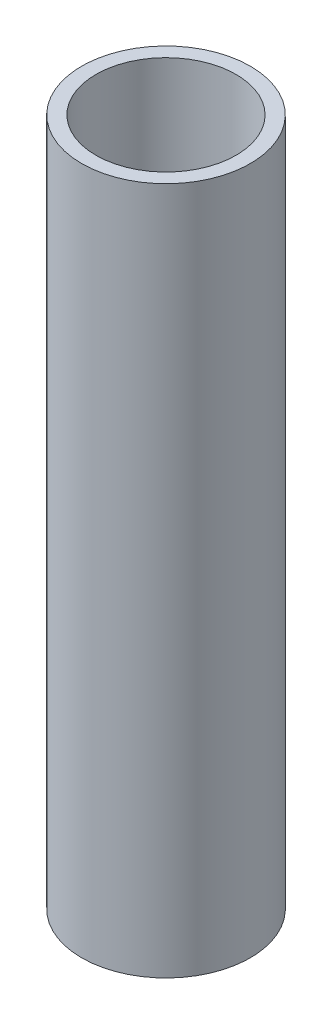
ISO-10303-21;
HEADER;
FILE_DESCRIPTION(('STEP AP214'),'2;1');
FILE_NAME('part.step','',(''),(''),'','','');
FILE_SCHEMA(('AUTOMOTIVE_DESIGN { 1 0 10303 214 1 1 1 1 }'));
ENDSEC;
DATA;
#1=APPLICATION_CONTEXT('core data for automotive mechanical design processes');
#2=APPLICATION_PROTOCOL_DEFINITION('international standard','automotive_design',2000,#1);
#3=PRODUCT_CONTEXT('',#1,'mechanical');
#4=PRODUCT('Part','Part','',(#3));
#5=PRODUCT_RELATED_PRODUCT_CATEGORY('part','',(#4));
#6=PRODUCT_DEFINITION_FORMATION('','',#4);
#7=PRODUCT_DEFINITION_CONTEXT('part definition',#1,'design');
#8=PRODUCT_DEFINITION('design','',#6,#7);
#9=PRODUCT_DEFINITION_SHAPE('','',#8);
#10=(LENGTH_UNIT() NAMED_UNIT(*) SI_UNIT(.MILLI.,.METRE.));
#11=(NAMED_UNIT(*) PLANE_ANGLE_UNIT() SI_UNIT($,.RADIAN.));
#12=(NAMED_UNIT(*) SI_UNIT($,.STERADIAN.) SOLID_ANGLE_UNIT());
#13=UNCERTAINTY_MEASURE_WITH_UNIT(LENGTH_MEASURE(1.E-05),#10,'distance_accuracy_value','');
#14=(GEOMETRIC_REPRESENTATION_CONTEXT(3) GLOBAL_UNCERTAINTY_ASSIGNED_CONTEXT((#13)) GLOBAL_UNIT_ASSIGNED_CONTEXT((#10,
#11,#12)) REPRESENTATION_CONTEXT('',''));
#15=CARTESIAN_POINT('',(0.,0.,0.));
#16=DIRECTION('',(0.,0.,1.));
#17=DIRECTION('',(1.,0.,0.));
#18=AXIS2_PLACEMENT_3D('',#15,#16,#17);
#19=CARTESIAN_POINT('',(0.,336.55,0.));
#20=DIRECTION('',(0.,-1.,0.));
#21=DIRECTION('',(0.,0.,-1.));
#22=AXIS2_PLACEMENT_3D('',#19,#20,#21);
#23=CYLINDRICAL_SURFACE('',#22,37.465);
#24=CARTESIAN_POINT('',(0.,0.,0.));
#25=DIRECTION('',(0.,1.,0.));
#26=DIRECTION('',(0.,0.,1.));
#27=AXIS2_PLACEMENT_3D('',#24,#25,#26);
#28=CIRCLE('',#27,37.465);
#29=CARTESIAN_POINT('',(0.,0.,37.465));
#30=VERTEX_POINT('',#29);
#31=EDGE_CURVE('E51',#30,#30,#28,.T.);
#32=ORIENTED_EDGE('',*,*,#31,.F.);
#33=EDGE_LOOP('',(#32));
#34=FACE_BOUND('',#33,.T.);
#35=CARTESIAN_POINT('',(0.,243.078,0.));
#36=DIRECTION('',(0.,1.,0.));
#37=DIRECTION('',(0.,0.,1.));
#38=AXIS2_PLACEMENT_3D('',#35,#36,#37);
#39=CIRCLE('',#38,37.465);
#40=CARTESIAN_POINT('',(0.,243.078,37.465));
#41=VERTEX_POINT('',#40);
#42=EDGE_CURVE('E45',#41,#41,#39,.T.);
#43=ORIENTED_EDGE('',*,*,#42,.T.);
#44=EDGE_LOOP('',(#43));
#45=FACE_BOUND('',#44,.T.);
#46=ADVANCED_FACE('F39',(#34,#45),#23,.F.);
#47=CARTESIAN_POINT('',(0.,336.55,0.));
#48=DIRECTION('',(0.,-1.,0.));
#49=DIRECTION('',(0.,0.,-1.));
#50=AXIS2_PLACEMENT_3D('',#47,#48,#49);
#51=CYLINDRICAL_SURFACE('',#50,41.275);
#52=CARTESIAN_POINT('',(0.,336.55,0.));
#53=DIRECTION('',(0.,1.,0.));
#54=DIRECTION('',(0.,0.,1.));
#55=AXIS2_PLACEMENT_3D('',#52,#53,#54);
#56=CIRCLE('',#55,41.275);
#57=CARTESIAN_POINT('',(0.,336.55,41.275));
#58=VERTEX_POINT('',#57);
#59=EDGE_CURVE('E10',#58,#58,#56,.T.);
#60=ORIENTED_EDGE('',*,*,#59,.F.);
#61=EDGE_LOOP('',(#60));
#62=FACE_BOUND('',#61,.T.);
#63=CARTESIAN_POINT('',(0.,0.,0.));
#64=DIRECTION('',(0.,1.,0.));
#65=DIRECTION('',(0.,0.,1.));
#66=AXIS2_PLACEMENT_3D('',#63,#64,#65);
#67=CIRCLE('',#66,41.275);
#68=CARTESIAN_POINT('',(0.,0.,41.275));
#69=VERTEX_POINT('',#68);
#70=EDGE_CURVE('E46',#69,#69,#67,.T.);
#71=ORIENTED_EDGE('',*,*,#70,.T.);
#72=EDGE_LOOP('',(#71));
#73=FACE_BOUND('',#72,.T.);
#74=ADVANCED_FACE('F74',(#62,#73),#51,.T.);
#75=CARTESIAN_POINT('',(0.,336.55,0.));
#76=DIRECTION('',(0.,1.,0.));
#77=DIRECTION('',(0.,0.,1.));
#78=AXIS2_PLACEMENT_3D('',#75,#76,#77);
#79=PLANE('',#78);
#80=ORIENTED_EDGE('',*,*,#59,.T.);
#81=EDGE_LOOP('',(#80));
#82=FACE_BOUND('',#81,.T.);
#83=CARTESIAN_POINT('',(0.,336.55,0.));
#84=DIRECTION('',(0.,1.,0.));
#85=DIRECTION('',(0.,0.,1.));
#86=AXIS2_PLACEMENT_3D('',#83,#84,#85);
#87=CIRCLE('',#86,34.29);
#88=CARTESIAN_POINT('',(0.,336.55,34.29));
#89=VERTEX_POINT('',#88);
#90=EDGE_CURVE('E53',#89,#89,#87,.T.);
#91=ORIENTED_EDGE('',*,*,#90,.F.);
#92=EDGE_LOOP('',(#91));
#93=FACE_BOUND('',#92,.T.);
#94=ADVANCED_FACE('F72',(#82,#93),#79,.T.);
#95=CARTESIAN_POINT('',(0.,0.,0.));
#96=DIRECTION('',(0.,1.,0.));
#97=DIRECTION('',(0.,0.,1.));
#98=AXIS2_PLACEMENT_3D('',#95,#96,#97);
#99=PLANE('',#98);
#100=ORIENTED_EDGE('',*,*,#31,.T.);
#101=EDGE_LOOP('',(#100));
#102=FACE_BOUND('',#101,.T.);
#103=ORIENTED_EDGE('',*,*,#70,.F.);
#104=EDGE_LOOP('',(#103));
#105=FACE_BOUND('',#104,.T.);
#106=ADVANCED_FACE('F71',(#102,#105),#99,.F.);
#107=CARTESIAN_POINT('',(0.,243.078,0.));
#108=DIRECTION('',(0.,1.,0.));
#109=DIRECTION('',(0.,0.,1.));
#110=AXIS2_PLACEMENT_3D('',#107,#108,#109);
#111=PLANE('',#110);
#112=CARTESIAN_POINT('',(0.,243.078,0.));
#113=DIRECTION('',(0.,1.,0.));
#114=DIRECTION('',(0.,0.,1.));
#115=AXIS2_PLACEMENT_3D('',#112,#113,#114);
#116=CIRCLE('',#115,34.29);
#117=CARTESIAN_POINT('',(0.,243.078,34.29));
#118=VERTEX_POINT('',#117);
#119=EDGE_CURVE('E58',#118,#118,#116,.T.);
#120=ORIENTED_EDGE('',*,*,#119,.T.);
#121=EDGE_LOOP('',(#120));
#122=FACE_BOUND('',#121,.T.);
#123=ORIENTED_EDGE('',*,*,#42,.F.);
#124=EDGE_LOOP('',(#123));
#125=FACE_BOUND('',#124,.T.);
#126=ADVANCED_FACE('F81',(#122,#125),#111,.F.);
#127=CARTESIAN_POINT('',(0.,243.078,0.));
#128=DIRECTION('',(0.,1.,0.));
#129=DIRECTION('',(0.,0.,1.));
#130=AXIS2_PLACEMENT_3D('',#127,#128,#129);
#131=CYLINDRICAL_SURFACE('',#130,34.29);
#132=ORIENTED_EDGE('',*,*,#119,.F.);
#133=EDGE_LOOP('',(#132));
#134=FACE_BOUND('',#133,.T.);
#135=ORIENTED_EDGE('',*,*,#90,.T.);
#136=EDGE_LOOP('',(#135));
#137=FACE_BOUND('',#136,.T.);
#138=ADVANCED_FACE('F68',(#134,#137),#131,.F.);
#139=CLOSED_SHELL('',(#46,#74,#94,#106,#126,#138));
#140=MANIFOLD_SOLID_BREP('B2',#139);
#141=ADVANCED_BREP_SHAPE_REPRESENTATION('',(#18,#140),#14);
#142=SHAPE_DEFINITION_REPRESENTATION(#9,#141);
ENDSEC;
END-ISO-10303-21;
